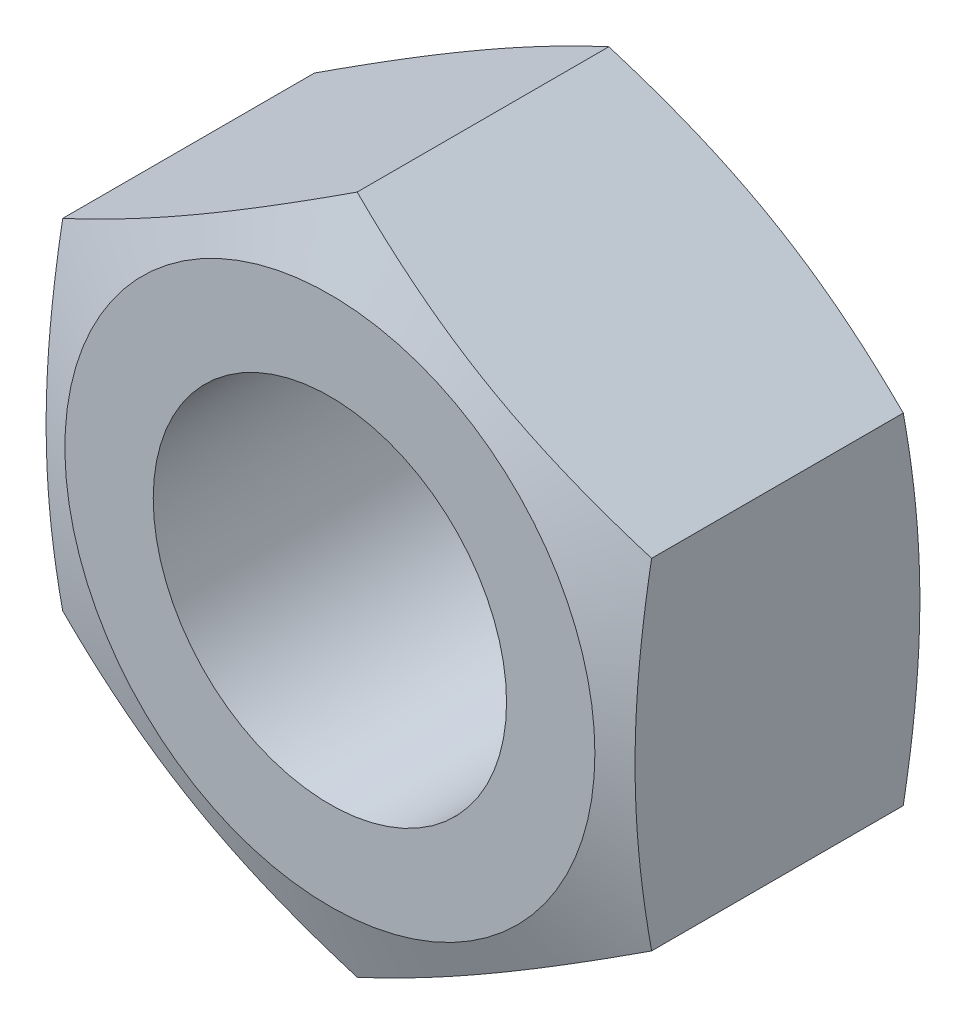
ISO-10303-21;
HEADER;
FILE_DESCRIPTION(('STEP AP214'),'2;1');
FILE_NAME('part.step','',(''),(''),'','','');
FILE_SCHEMA(('AUTOMOTIVE_DESIGN { 1 0 10303 214 1 1 1 1 }'));
ENDSEC;
DATA;
#1=APPLICATION_CONTEXT('core data for automotive mechanical design processes');
#2=APPLICATION_PROTOCOL_DEFINITION('international standard','automotive_design',2000,#1);
#3=PRODUCT_CONTEXT('',#1,'mechanical');
#4=PRODUCT('Part','Part','',(#3));
#5=PRODUCT_RELATED_PRODUCT_CATEGORY('part','',(#4));
#6=PRODUCT_DEFINITION_FORMATION('','',#4);
#7=PRODUCT_DEFINITION_CONTEXT('part definition',#1,'design');
#8=PRODUCT_DEFINITION('design','',#6,#7);
#9=PRODUCT_DEFINITION_SHAPE('','',#8);
#10=(LENGTH_UNIT() NAMED_UNIT(*) SI_UNIT(.MILLI.,.METRE.));
#11=(NAMED_UNIT(*) PLANE_ANGLE_UNIT() SI_UNIT($,.RADIAN.));
#12=(NAMED_UNIT(*) SI_UNIT($,.STERADIAN.) SOLID_ANGLE_UNIT());
#13=UNCERTAINTY_MEASURE_WITH_UNIT(LENGTH_MEASURE(1.E-05),#10,'distance_accuracy_value','');
#14=(GEOMETRIC_REPRESENTATION_CONTEXT(3) GLOBAL_UNCERTAINTY_ASSIGNED_CONTEXT((#13)) GLOBAL_UNIT_ASSIGNED_CONTEXT((#10,
#11,#12)) REPRESENTATION_CONTEXT('',''));
#15=CARTESIAN_POINT('',(0.,0.,0.));
#16=DIRECTION('',(0.,0.,1.));
#17=DIRECTION('',(1.,0.,0.));
#18=AXIS2_PLACEMENT_3D('',#15,#16,#17);
#19=CARTESIAN_POINT('',(5.,2.88675134594813,5.2));
#20=DIRECTION('',(-0.5,-0.866025403784439,0.));
#21=DIRECTION('',(0.866025403784439,-0.5,0.));
#22=AXIS2_PLACEMENT_3D('',#19,#20,#21);
#23=PLANE('',#22);
#24=DIRECTION('',(0.,0.,-1.));
#25=VECTOR('',#24,1.);
#26=CARTESIAN_POINT('',(5.,2.88675134594813,5.2));
#27=LINE('',#26,#25);
#28=CARTESIAN_POINT('',(5.,2.88675134594813,4.73648292689189));
#29=VERTEX_POINT('',#28);
#30=CARTESIAN_POINT('',(5.,2.88675134594813,0.463517073108111));
#31=VERTEX_POINT('',#30);
#32=EDGE_CURVE('E106',#29,#31,#27,.T.);
#33=ORIENTED_EDGE('',*,*,#32,.T.);
#34=CARTESIAN_POINT('',(5.0002,2.88663587589429,0.463559102031462));
#35=CARTESIAN_POINT('',(4.793122539321,3.00619210356042,0.42002728062305));
#36=CARTESIAN_POINT('',(4.58536221220616,3.12614258434709,0.380427506316752));
#37=CARTESIAN_POINT('',(4.16849063548728,3.36682350138324,0.310757770445215));
#38=CARTESIAN_POINT('',(3.95937845852842,3.48755447304127,0.280695266568772));
#39=CARTESIAN_POINT('',(3.54212392488155,3.72845649036288,0.232070006277416));
#40=CARTESIAN_POINT('',(3.33399109798324,3.84862203399982,0.213401187348765));
#41=CARTESIAN_POINT('',(2.91723870610194,4.0892341396379,0.188361048549594));
#42=CARTESIAN_POINT('',(2.70861935305097,4.20968057928005,0.181985117133098));
#43=CARTESIAN_POINT('',(2.29138064694903,4.45057345856434,0.181985117133098));
#44=CARTESIAN_POINT('',(2.08276129389806,4.57101989820648,0.188361048549594));
#45=CARTESIAN_POINT('',(1.66600890201676,4.81163200384457,0.213401187348764));
#46=CARTESIAN_POINT('',(1.45787607511845,4.93179754748151,0.232070006277416));
#47=CARTESIAN_POINT('',(1.04062154147158,5.17269956480312,0.280695266568772));
#48=CARTESIAN_POINT('',(0.831509364512723,5.29343053646114,0.310757770445214));
#49=CARTESIAN_POINT('',(0.414637787793839,5.53411145349729,0.380427506316752));
#50=CARTESIAN_POINT('',(0.206877460678999,5.65406193428397,0.420027280623049));
#51=CARTESIAN_POINT('',(-0.00019999999999951,5.77361816195009,0.463559102031462));
#52=B_SPLINE_CURVE_WITH_KNOTS('',3,(#34,#35,#36,#37,#38,#39,#40,#41,#42,#43,#44,#45,#46,#47,#48,
#49,#50,#51),.UNSPECIFIED.,.F.,.F.,(4,2,2,2,2,2,2,2,4),(0.,0.729203512834577,1.45897583043699,
2.18184682225058,2.90444658389739,3.6270463455442,4.34991733735779,5.0796896549602,
5.80889316779478),.UNSPECIFIED.);
#53=CARTESIAN_POINT('',(0.,5.77350269189626,0.463517073108112));
#54=VERTEX_POINT('',#53);
#55=EDGE_CURVE('E57',#31,#54,#52,.T.);
#56=ORIENTED_EDGE('',*,*,#55,.T.);
#57=DIRECTION('',(0.,0.,-1.));
#58=VECTOR('',#57,1.);
#59=CARTESIAN_POINT('',(0.,5.77350269189626,5.2));
#60=LINE('',#59,#58);
#61=CARTESIAN_POINT('',(0.,5.77350269189626,4.73648292689189));
#62=VERTEX_POINT('',#61);
#63=EDGE_CURVE('E11',#62,#54,#60,.T.);
#64=ORIENTED_EDGE('',*,*,#63,.F.);
#65=CARTESIAN_POINT('',(-0.000199999999999613,5.77361816195009,4.73644089796854));
#66=CARTESIAN_POINT('',(0.206877460679,5.65406193428397,4.77997271937695));
#67=CARTESIAN_POINT('',(0.414637787793839,5.53411145349729,4.81957249368325));
#68=CARTESIAN_POINT('',(0.831509364512722,5.29343053646114,4.88924222955479));
#69=CARTESIAN_POINT('',(1.04062154147158,5.17269956480312,4.91930473343123));
#70=CARTESIAN_POINT('',(1.45787607511845,4.93179754748151,4.96792999372258));
#71=CARTESIAN_POINT('',(1.66600890201676,4.81163200384457,4.98659881265124));
#72=CARTESIAN_POINT('',(2.08276129389806,4.57101989820648,5.01163895145041));
#73=CARTESIAN_POINT('',(2.29138064694903,4.45057345856434,5.0180148828669));
#74=CARTESIAN_POINT('',(2.70861935305097,4.20968057928005,5.0180148828669));
#75=CARTESIAN_POINT('',(2.91723870610194,4.0892341396379,5.01163895145041));
#76=CARTESIAN_POINT('',(3.33399109798324,3.84862203399982,4.98659881265124));
#77=CARTESIAN_POINT('',(3.54212392488155,3.72845649036288,4.96792999372258));
#78=CARTESIAN_POINT('',(3.95937845852842,3.48755447304127,4.91930473343123));
#79=CARTESIAN_POINT('',(4.16849063548728,3.36682350138324,4.88924222955478));
#80=CARTESIAN_POINT('',(4.58536221220616,3.12614258434709,4.81957249368325));
#81=CARTESIAN_POINT('',(4.793122539321,3.00619210356042,4.77997271937695));
#82=CARTESIAN_POINT('',(5.0002,2.88663587589429,4.73644089796854));
#83=B_SPLINE_CURVE_WITH_KNOTS('',3,(#65,#66,#67,#68,#69,#70,#71,#72,#73,#74,#75,#76,#77,#78,#79,
#80,#81,#82),.UNSPECIFIED.,.F.,.F.,(4,2,2,2,2,2,2,2,4),(0.,0.729203512834576,1.45897583043699,
2.18184682225058,2.90444658389739,3.6270463455442,4.34991733735779,5.0796896549602,
5.80889316779478),.UNSPECIFIED.);
#84=EDGE_CURVE('E113',#62,#29,#83,.T.);
#85=ORIENTED_EDGE('',*,*,#84,.T.);
#86=EDGE_LOOP('',(#33,#56,#64,#85));
#87=FACE_BOUND('',#86,.T.);
#88=ADVANCED_FACE('F42',(#87),#23,.F.);
#89=CARTESIAN_POINT('',(0.,5.77350269189626,5.2));
#90=DIRECTION('',(0.5,-0.866025403784439,0.));
#91=DIRECTION('',(0.866025403784439,0.5,0.));
#92=AXIS2_PLACEMENT_3D('',#89,#90,#91);
#93=PLANE('',#92);
#94=ORIENTED_EDGE('',*,*,#63,.T.);
#95=CARTESIAN_POINT('',(0.000200000000000437,5.7736181619501,0.463559102031462));
#96=CARTESIAN_POINT('',(-0.206877460678999,5.65406193428397,0.42002728062305));
#97=CARTESIAN_POINT('',(-0.414637787793838,5.53411145349729,0.380427506316752));
#98=CARTESIAN_POINT('',(-0.831509364512722,5.29343053646114,0.310757770445215));
#99=CARTESIAN_POINT('',(-1.04062154147157,5.17269956480312,0.280695266568772));
#100=CARTESIAN_POINT('',(-1.45787607511845,4.93179754748151,0.232070006277416));
#101=CARTESIAN_POINT('',(-1.66600890201676,4.81163200384457,0.213401187348764));
#102=CARTESIAN_POINT('',(-2.08276129389805,4.57101989820648,0.188361048549594));
#103=CARTESIAN_POINT('',(-2.29138064694903,4.45057345856434,0.181985117133098));
#104=CARTESIAN_POINT('',(-2.70861935305097,4.20968057928005,0.181985117133098));
#105=CARTESIAN_POINT('',(-2.91723870610194,4.08923413963791,0.188361048549594));
#106=CARTESIAN_POINT('',(-3.33399109798324,3.84862203399982,0.213401187348764));
#107=CARTESIAN_POINT('',(-3.54212392488155,3.72845649036288,0.232070006277416));
#108=CARTESIAN_POINT('',(-3.95937845852842,3.48755447304127,0.280695266568772));
#109=CARTESIAN_POINT('',(-4.16849063548728,3.36682350138325,0.310757770445214));
#110=CARTESIAN_POINT('',(-4.58536221220616,3.12614258434709,0.380427506316752));
#111=CARTESIAN_POINT('',(-4.793122539321,3.00619210356042,0.420027280623049));
#112=CARTESIAN_POINT('',(-5.0002,2.88663587589429,0.463559102031462));
#113=B_SPLINE_CURVE_WITH_KNOTS('',3,(#95,#96,#97,#98,#99,#100,#101,#102,#103,#104,#105,#106,
#107,#108,#109,#110,#111,#112),.UNSPECIFIED.,.F.,.F.,(4,2,2,2,2,2,2,2,4),(0.,0.729203512834577,
1.45897583043698,2.18184682225058,2.90444658389739,3.6270463455442,4.34991733735779,
5.0796896549602,5.80889316779478),.UNSPECIFIED.);
#114=CARTESIAN_POINT('',(-5.,2.88675134594813,0.463517073108112));
#115=VERTEX_POINT('',#114);
#116=EDGE_CURVE('E93',#54,#115,#113,.T.);
#117=ORIENTED_EDGE('',*,*,#116,.T.);
#118=DIRECTION('',(0.,0.,-1.));
#119=VECTOR('',#118,1.);
#120=CARTESIAN_POINT('',(-5.,2.88675134594813,5.2));
#121=LINE('',#120,#119);
#122=CARTESIAN_POINT('',(-5.,2.88675134594813,4.73648292689189));
#123=VERTEX_POINT('',#122);
#124=EDGE_CURVE('E50',#123,#115,#121,.T.);
#125=ORIENTED_EDGE('',*,*,#124,.F.);
#126=CARTESIAN_POINT('',(-5.0002,2.88663587589429,4.73644089796854));
#127=CARTESIAN_POINT('',(-4.793122539321,3.00619210356042,4.77997271937695));
#128=CARTESIAN_POINT('',(-4.58536221220616,3.12614258434709,4.81957249368325));
#129=CARTESIAN_POINT('',(-4.16849063548728,3.36682350138324,4.88924222955478));
#130=CARTESIAN_POINT('',(-3.95937845852842,3.48755447304127,4.91930473343123));
#131=CARTESIAN_POINT('',(-3.54212392488155,3.72845649036288,4.96792999372258));
#132=CARTESIAN_POINT('',(-3.33399109798324,3.84862203399982,4.98659881265124));
#133=CARTESIAN_POINT('',(-2.91723870610194,4.0892341396379,5.01163895145041));
#134=CARTESIAN_POINT('',(-2.70861935305097,4.20968057928005,5.0180148828669));
#135=CARTESIAN_POINT('',(-2.29138064694903,4.45057345856434,5.0180148828669));
#136=CARTESIAN_POINT('',(-2.08276129389806,4.57101989820648,5.01163895145041));
#137=CARTESIAN_POINT('',(-1.66600890201676,4.81163200384457,4.98659881265124));
#138=CARTESIAN_POINT('',(-1.45787607511845,4.93179754748151,4.96792999372258));
#139=CARTESIAN_POINT('',(-1.04062154147158,5.17269956480312,4.91930473343123));
#140=CARTESIAN_POINT('',(-0.831509364512723,5.29343053646114,4.88924222955479));
#141=CARTESIAN_POINT('',(-0.414637787793839,5.53411145349729,4.81957249368325));
#142=CARTESIAN_POINT('',(-0.206877460678999,5.65406193428397,4.77997271937695));
#143=CARTESIAN_POINT('',(0.000199999999999708,5.77361816195009,4.73644089796854));
#144=B_SPLINE_CURVE_WITH_KNOTS('',3,(#126,#127,#128,#129,#130,#131,#132,#133,#134,#135,#136,
#137,#138,#139,#140,#141,#142,#143),.UNSPECIFIED.,.F.,.F.,(4,2,2,2,2,2,2,2,4),(0.,
0.729203512834576,1.45897583043699,2.18184682225058,2.90444658389739,3.6270463455442,
4.34991733735779,5.0796896549602,5.80889316779478),.UNSPECIFIED.);
#145=EDGE_CURVE('E111',#123,#62,#144,.T.);
#146=ORIENTED_EDGE('',*,*,#145,.T.);
#147=EDGE_LOOP('',(#94,#117,#125,#146));
#148=FACE_BOUND('',#147,.T.);
#149=ADVANCED_FACE('F110',(#148),#93,.F.);
#150=CARTESIAN_POINT('',(-5.,2.88675134594813,5.2));
#151=DIRECTION('',(1.,0.,0.));
#152=DIRECTION('',(0.,1.,0.));
#153=AXIS2_PLACEMENT_3D('',#150,#151,#152);
#154=PLANE('',#153);
#155=ORIENTED_EDGE('',*,*,#124,.T.);
#156=CARTESIAN_POINT('',(-5.,-7.62577906692791,1.68110557708335));
#157=CARTESIAN_POINT('',(-5.,-7.39973732850278,1.61232290372658));
#158=CARTESIAN_POINT('',(-5.,-7.17344560747789,1.54434668666239));
#159=CARTESIAN_POINT('',(-5.,-6.72023496786584,1.4104533581759));
#160=CARTESIAN_POINT('',(-5.,-6.49331600080425,1.34453641103066));
#161=CARTESIAN_POINT('',(-5.,-6.03833144551677,1.21509710620893));
#162=CARTESIAN_POINT('',(-5.,-5.81026450257581,1.15157949318037));
#163=CARTESIAN_POINT('',(-5.,-5.35327977716749,1.027686998097));
#164=CARTESIAN_POINT('',(-5.,-5.12436201018559,0.967312059141014));
#165=CARTESIAN_POINT('',(-5.,-4.66837924069835,0.85121014946402));
#166=CARTESIAN_POINT('',(-5.,-4.44132665054132,0.795434672715088));
#167=CARTESIAN_POINT('',(-5.,-3.98610278527542,0.688661759385178));
#168=CARTESIAN_POINT('',(-5.,-3.75793155623224,0.637664127762475));
#169=CARTESIAN_POINT('',(-5.,-3.30040291605934,0.541636385908812));
#170=CARTESIAN_POINT('',(-5.,-3.07104591163479,0.496604354541588));
#171=CARTESIAN_POINT('',(-5.,-2.61100127070718,0.413885508052961));
#172=CARTESIAN_POINT('',(-5.,-2.38031367944826,0.376198444677951));
#173=CARTESIAN_POINT('',(-5.,-1.94361500804652,0.31343759806696));
#174=CARTESIAN_POINT('',(-5.,-1.7377404283577,0.287422870136569));
#175=CARTESIAN_POINT('',(-5.,-1.32512603178955,0.243443876542075));
#176=CARTESIAN_POINT('',(-5.,-1.1183862403761,0.225479375593521));
#177=CARTESIAN_POINT('',(-5.,-0.704461111310275,0.198466230617729));
#178=CARTESIAN_POINT('',(-5.,-0.497276187682008,0.189411344144595));
#179=CARTESIAN_POINT('',(-5.,-0.0827066694415578,0.180675368238058));
#180=CARTESIAN_POINT('',(-5.,0.124677923844358,0.180994216965114));
#181=CARTESIAN_POINT('',(-5.,0.540283470227912,0.191014021569927));
#182=CARTESIAN_POINT('',(-5.,0.748503241235951,0.200763207247524));
#183=CARTESIAN_POINT('',(-5.,1.16432661228743,0.229195694847162));
#184=CARTESIAN_POINT('',(-5.,1.37193019742069,0.247879211212779));
#185=CARTESIAN_POINT('',(-5.,1.78642062399795,0.293310008096314));
#186=CARTESIAN_POINT('',(-5.,1.99330669800377,0.320064190888322));
#187=CARTESIAN_POINT('',(-5.,2.40604369125849,0.380556169518772));
#188=CARTESIAN_POINT('',(-5.,2.61189460556104,0.414293998695126));
#189=CARTESIAN_POINT('',(-5.,3.03486862606037,0.48986449701936));
#190=CARTESIAN_POINT('',(-5.,3.25192603358502,0.532061691200861));
#191=CARTESIAN_POINT('',(-5.,3.68492123231093,0.621887689980025));
#192=CARTESIAN_POINT('',(-5.,3.90085893664527,0.669516909594772));
#193=CARTESIAN_POINT('',(-5.,4.33177116274142,0.76920107740676));
#194=CARTESIAN_POINT('',(-5.,4.54674538165166,0.821257326729363));
#195=CARTESIAN_POINT('',(-5.,4.97578638620893,0.928945457635204));
#196=CARTESIAN_POINT('',(-5.,5.18985319381151,0.98457725217277));
#197=CARTESIAN_POINT('',(-5.,5.61748376706862,1.09881748999222));
#198=CARTESIAN_POINT('',(-5.,5.83104652944243,1.15742967554669));
#199=CARTESIAN_POINT('',(-5.,6.2575062430239,1.27703251601743));
#200=CARTESIAN_POINT('',(-5.,6.47040318438765,1.33802320592106));
#201=CARTESIAN_POINT('',(-5.,7.10816878406084,1.52387795762354));
#202=CARTESIAN_POINT('',(-5.,7.53219060521417,1.65164600340336));
#203=CARTESIAN_POINT('',(-5.,8.37376638934151,1.91099646113511));
#204=CARTESIAN_POINT('',(-5.,8.79133900560871,2.0425188384191));
#205=CARTESIAN_POINT('',(-5.,9.62531656147031,2.30927659196911));
#206=CARTESIAN_POINT('',(-5.,10.0417214432998,2.44451214846679));
#207=CARTESIAN_POINT('',(-5.,10.8720585516144,2.7171651072236));
#208=CARTESIAN_POINT('',(-5.,11.2859941575418,2.85457224827374));
#209=CARTESIAN_POINT('',(-5.,12.1131437905115,3.13143055606296));
#210=CARTESIAN_POINT('',(-5.,12.5263578743287,3.27088155303858));
#211=CARTESIAN_POINT('',(-5.,12.9393260697749,3.41104737168424));
#212=B_SPLINE_CURVE_WITH_KNOTS('',3,(#156,#157,#158,#159,#160,#161,#162,#163,#164,#165,#166,
#167,#168,#169,#170,#171,#172,#173,#174,#175,#176,#177,#178,#179,#180,#181,#182,#183,#184,#185,
#186,#187,#188,#189,#190,#191,#192,#193,#194,#195,#196,#197,#198,#199,#200,#201,#202,#203,#204,
#205,#206,#207,#208,#209,#210,#211),.UNSPECIFIED.,.F.,.F.,(4,2,2,2,2,2,2,2,2,2,2,2,2,2,2,2,2,2,
2,2,2,2,2,2,2,2,2,4),(0.,0.70883036915644,1.41771714119476,2.12793926066641,2.83814851639712,
3.53951632412979,4.24085548806128,4.94196824383921,5.64305729849731,6.26545529357321,
6.88783509660005,7.50977852332254,8.1317178470182,8.75685488001581,9.38200691842967,
10.0076951285828,10.6333863256597,11.296663991941,11.9599923678895,12.6235163774958,
13.2870242399054,13.9513868500891,14.6157592366149,15.9442603616081,17.2576272077133,
18.5710579155931,19.879490470661,21.1878149558909),.UNSPECIFIED.);
#213=CARTESIAN_POINT('',(-5.,-2.88675134594813,0.463517073108112));
#214=VERTEX_POINT('',#213);
#215=EDGE_CURVE('E96',#115,#214,#212,.F.);
#216=ORIENTED_EDGE('',*,*,#215,.T.);
#217=DIRECTION('',(0.,0.,-1.));
#218=VECTOR('',#217,1.);
#219=CARTESIAN_POINT('',(-5.,-2.88675134594813,5.2));
#220=LINE('',#219,#218);
#221=CARTESIAN_POINT('',(-5.,-2.88675134594813,4.73648292689189));
#222=VERTEX_POINT('',#221);
#223=EDGE_CURVE('E222',#222,#214,#220,.T.);
#224=ORIENTED_EDGE('',*,*,#223,.F.);
#225=CARTESIAN_POINT('',(-5.,-7.62577906692791,3.51889442291665));
#226=CARTESIAN_POINT('',(-5.,-7.39973732850277,3.58767709627342));
#227=CARTESIAN_POINT('',(-5.,-7.17344560747789,3.65565331333761));
#228=CARTESIAN_POINT('',(-5.,-6.72023496786584,3.7895466418241));
#229=CARTESIAN_POINT('',(-5.,-6.49331600080425,3.85546358896934));
#230=CARTESIAN_POINT('',(-5.,-6.03833144551676,3.98490289379107));
#231=CARTESIAN_POINT('',(-5.,-5.81026450257581,4.04842050681964));
#232=CARTESIAN_POINT('',(-5.,-5.35327977716749,4.172313001903));
#233=CARTESIAN_POINT('',(-5.,-5.12436201018558,4.23268794085899));
#234=CARTESIAN_POINT('',(-5.,-4.66837924069834,4.34878985053598));
#235=CARTESIAN_POINT('',(-5.,-4.44132665054132,4.40456532728491));
#236=CARTESIAN_POINT('',(-5.,-3.98610278527542,4.51133824061482));
#237=CARTESIAN_POINT('',(-5.,-3.75793155623224,4.56233587223752));
#238=CARTESIAN_POINT('',(-5.,-3.30040291605934,4.65836361409119));
#239=CARTESIAN_POINT('',(-5.,-3.07104591163479,4.70339564545841));
#240=CARTESIAN_POINT('',(-5.,-2.61100127070718,4.78611449194704));
#241=CARTESIAN_POINT('',(-5.,-2.38031367944826,4.82380155532205));
#242=CARTESIAN_POINT('',(-5.,-1.94361500804652,4.88656240193304));
#243=CARTESIAN_POINT('',(-5.,-1.7377404283577,4.91257712986343));
#244=CARTESIAN_POINT('',(-5.,-1.32512603178955,4.95655612345792));
#245=CARTESIAN_POINT('',(-5.,-1.1183862403761,4.97452062440648));
#246=CARTESIAN_POINT('',(-5.,-0.704461111310274,5.00153376938227));
#247=CARTESIAN_POINT('',(-5.,-0.497276187682007,5.0105886558554));
#248=CARTESIAN_POINT('',(-5.,-0.0827066694415569,5.01932463176194));
#249=CARTESIAN_POINT('',(-5.,0.124677923844359,5.01900578303488));
#250=CARTESIAN_POINT('',(-5.,0.540283470227913,5.00898597843007));
#251=CARTESIAN_POINT('',(-5.,0.748503241235951,4.99923679275248));
#252=CARTESIAN_POINT('',(-5.,1.16432661228743,4.97080430515284));
#253=CARTESIAN_POINT('',(-5.,1.37193019742069,4.95212078878722));
#254=CARTESIAN_POINT('',(-5.,1.78642062399795,4.90668999190369));
#255=CARTESIAN_POINT('',(-5.,1.99330669800377,4.87993580911168));
#256=CARTESIAN_POINT('',(-5.,2.4060436912585,4.81944383048123));
#257=CARTESIAN_POINT('',(-5.,2.61189460556104,4.78570600130487));
#258=CARTESIAN_POINT('',(-5.,3.03486862606037,4.71013550298064));
#259=CARTESIAN_POINT('',(-5.,3.25192603358502,4.66793830879914));
#260=CARTESIAN_POINT('',(-5.,3.68492123231093,4.57811231001998));
#261=CARTESIAN_POINT('',(-5.,3.90085893664527,4.53048309040523));
#262=CARTESIAN_POINT('',(-5.,4.33177116274142,4.43079892259324));
#263=CARTESIAN_POINT('',(-5.,4.54674538165166,4.37874267327064));
#264=CARTESIAN_POINT('',(-5.,4.97578638620893,4.2710545423648));
#265=CARTESIAN_POINT('',(-5.,5.18985319381151,4.21542274782723));
#266=CARTESIAN_POINT('',(-5.,5.61748376706862,4.10118251000778));
#267=CARTESIAN_POINT('',(-5.,5.83104652944243,4.04257032445331));
#268=CARTESIAN_POINT('',(-5.,6.2575062430239,3.92296748398257));
#269=CARTESIAN_POINT('',(-5.,6.47040318438765,3.86197679407894));
#270=CARTESIAN_POINT('',(-5.,7.10816878406084,3.67612204237646));
#271=CARTESIAN_POINT('',(-5.,7.53219060521417,3.54835399659664));
#272=CARTESIAN_POINT('',(-5.,8.37376638934151,3.28900353886489));
#273=CARTESIAN_POINT('',(-5.,8.79133900560871,3.1574811615809));
#274=CARTESIAN_POINT('',(-5.,9.62531656147031,2.89072340803089));
#275=CARTESIAN_POINT('',(-5.,10.0417214432998,2.75548785153321));
#276=CARTESIAN_POINT('',(-5.,10.8720585516144,2.48283489277639));
#277=CARTESIAN_POINT('',(-5.,11.2859941575418,2.34542775172625));
#278=CARTESIAN_POINT('',(-5.,12.1131437905115,2.06856944393704));
#279=CARTESIAN_POINT('',(-5.,12.5263578743287,1.92911844696142));
#280=CARTESIAN_POINT('',(-5.,12.9393260697749,1.78895262831576));
#281=B_SPLINE_CURVE_WITH_KNOTS('',3,(#225,#226,#227,#228,#229,#230,#231,#232,#233,#234,#235,
#236,#237,#238,#239,#240,#241,#242,#243,#244,#245,#246,#247,#248,#249,#250,#251,#252,#253,#254,
#255,#256,#257,#258,#259,#260,#261,#262,#263,#264,#265,#266,#267,#268,#269,#270,#271,#272,#273,
#274,#275,#276,#277,#278,#279,#280),.UNSPECIFIED.,.F.,.F.,(4,2,2,2,2,2,2,2,2,2,2,2,2,2,2,2,2,2,
2,2,2,2,2,2,2,2,2,4),(0.,0.708830369156441,1.41771714119476,2.12793926066641,2.83814851639712,
3.5395163241298,4.24085548806128,4.94196824383921,5.64305729849731,6.26545529357321,
6.88783509660005,7.50977852332254,8.1317178470182,8.7568548800158,9.38200691842967,
10.0076951285828,10.6333863256597,11.296663991941,11.9599923678895,12.6235163774958,
13.2870242399054,13.9513868500891,14.6157592366149,15.9442603616081,17.2576272077133,
18.5710579155931,19.879490470661,21.1878149558909),.UNSPECIFIED.);
#282=EDGE_CURVE('E114',#222,#123,#281,.T.);
#283=ORIENTED_EDGE('',*,*,#282,.T.);
#284=EDGE_LOOP('',(#155,#216,#224,#283));
#285=FACE_BOUND('',#284,.T.);
#286=ADVANCED_FACE('F176',(#285),#154,.F.);
#287=CARTESIAN_POINT('',(-5.,-2.88675134594813,5.2));
#288=DIRECTION('',(0.5,0.866025403784439,0.));
#289=DIRECTION('',(-0.866025403784439,0.5,0.));
#290=AXIS2_PLACEMENT_3D('',#287,#288,#289);
#291=PLANE('',#290);
#292=ORIENTED_EDGE('',*,*,#223,.T.);
#293=CARTESIAN_POINT('',(-5.0002,-2.88663587589429,0.463559102031462));
#294=CARTESIAN_POINT('',(-4.793122539321,-3.00619210356042,0.42002728062305));
#295=CARTESIAN_POINT('',(-4.58536221220616,-3.12614258434709,0.380427506316753));
#296=CARTESIAN_POINT('',(-4.16849063548728,-3.36682350138324,0.310757770445215));
#297=CARTESIAN_POINT('',(-3.95937845852842,-3.48755447304127,0.280695266568772));
#298=CARTESIAN_POINT('',(-3.54212392488155,-3.72845649036288,0.232070006277416));
#299=CARTESIAN_POINT('',(-3.33399109798324,-3.84862203399982,0.213401187348765));
#300=CARTESIAN_POINT('',(-2.91723870610195,-4.0892341396379,0.188361048549594));
#301=CARTESIAN_POINT('',(-2.70861935305097,-4.20968057928005,0.181985117133098));
#302=CARTESIAN_POINT('',(-2.29138064694903,-4.45057345856434,0.181985117133098));
#303=CARTESIAN_POINT('',(-2.08276129389806,-4.57101989820648,0.188361048549595));
#304=CARTESIAN_POINT('',(-1.66600890201676,-4.81163200384457,0.213401187348765));
#305=CARTESIAN_POINT('',(-1.45787607511845,-4.93179754748151,0.232070006277416));
#306=CARTESIAN_POINT('',(-1.04062154147158,-5.17269956480312,0.280695266568772));
#307=CARTESIAN_POINT('',(-0.831509364512724,-5.29343053646114,0.310757770445215));
#308=CARTESIAN_POINT('',(-0.41463778779384,-5.53411145349729,0.380427506316752));
#309=CARTESIAN_POINT('',(-0.206877460679,-5.65406193428397,0.42002728062305));
#310=CARTESIAN_POINT('',(0.000199999999998887,-5.7736181619501,0.463559102031462));
#311=B_SPLINE_CURVE_WITH_KNOTS('',3,(#293,#294,#295,#296,#297,#298,#299,#300,#301,#302,#303,
#304,#305,#306,#307,#308,#309,#310),.UNSPECIFIED.,.F.,.F.,(4,2,2,2,2,2,2,2,4),(0.,
0.729203512834578,1.45897583043699,2.18184682225058,2.90444658389739,3.6270463455442,
4.3499173373578,5.07968965496021,5.80889316779478),.UNSPECIFIED.);
#312=CARTESIAN_POINT('',(0.,-5.77350269189626,0.463517073108112));
#313=VERTEX_POINT('',#312);
#314=EDGE_CURVE('E182',#214,#313,#311,.T.);
#315=ORIENTED_EDGE('',*,*,#314,.T.);
#316=DIRECTION('',(0.,0.,-1.));
#317=VECTOR('',#316,1.);
#318=CARTESIAN_POINT('',(0.,-5.77350269189626,5.2));
#319=LINE('',#318,#317);
#320=CARTESIAN_POINT('',(0.,-5.77350269189626,4.73648292689189));
#321=VERTEX_POINT('',#320);
#322=EDGE_CURVE('E218',#321,#313,#319,.T.);
#323=ORIENTED_EDGE('',*,*,#322,.F.);
#324=CARTESIAN_POINT('',(0.000199999999999722,-5.7736181619501,4.73644089796854));
#325=CARTESIAN_POINT('',(-0.206877460679,-5.65406193428397,4.77997271937695));
#326=CARTESIAN_POINT('',(-0.414637787793839,-5.53411145349729,4.81957249368325));
#327=CARTESIAN_POINT('',(-0.831509364512723,-5.29343053646114,4.88924222955478));
#328=CARTESIAN_POINT('',(-1.04062154147158,-5.17269956480312,4.91930473343123));
#329=CARTESIAN_POINT('',(-1.45787607511845,-4.93179754748151,4.96792999372258));
#330=CARTESIAN_POINT('',(-1.66600890201676,-4.81163200384457,4.98659881265124));
#331=CARTESIAN_POINT('',(-2.08276129389806,-4.57101989820648,5.01163895145041));
#332=CARTESIAN_POINT('',(-2.29138064694903,-4.45057345856434,5.0180148828669));
#333=CARTESIAN_POINT('',(-2.70861935305097,-4.20968057928005,5.0180148828669));
#334=CARTESIAN_POINT('',(-2.91723870610194,-4.0892341396379,5.01163895145041));
#335=CARTESIAN_POINT('',(-3.33399109798324,-3.84862203399982,4.98659881265124));
#336=CARTESIAN_POINT('',(-3.54212392488155,-3.72845649036288,4.96792999372258));
#337=CARTESIAN_POINT('',(-3.95937845852843,-3.48755447304127,4.91930473343123));
#338=CARTESIAN_POINT('',(-4.16849063548728,-3.36682350138324,4.88924222955479));
#339=CARTESIAN_POINT('',(-4.58536221220616,-3.12614258434709,4.81957249368325));
#340=CARTESIAN_POINT('',(-4.793122539321,-3.00619210356041,4.77997271937695));
#341=CARTESIAN_POINT('',(-5.0002,-2.88663587589429,4.73644089796854));
#342=B_SPLINE_CURVE_WITH_KNOTS('',3,(#324,#325,#326,#327,#328,#329,#330,#331,#332,#333,#334,
#335,#336,#337,#338,#339,#340,#341),.UNSPECIFIED.,.F.,.F.,(4,2,2,2,2,2,2,2,4),(0.,
0.729203512834577,1.45897583043699,2.18184682225058,2.90444658389739,3.6270463455442,
4.3499173373578,5.07968965496021,5.80889316779478),.UNSPECIFIED.);
#343=EDGE_CURVE('E117',#321,#222,#342,.T.);
#344=ORIENTED_EDGE('',*,*,#343,.T.);
#345=EDGE_LOOP('',(#292,#315,#323,#344));
#346=FACE_BOUND('',#345,.T.);
#347=ADVANCED_FACE('F172',(#346),#291,.F.);
#348=CARTESIAN_POINT('',(0.,-5.77350269189626,5.2));
#349=DIRECTION('',(-0.5,0.866025403784439,0.));
#350=DIRECTION('',(-0.866025403784439,-0.5,0.));
#351=AXIS2_PLACEMENT_3D('',#348,#349,#350);
#352=PLANE('',#351);
#353=ORIENTED_EDGE('',*,*,#322,.T.);
#354=CARTESIAN_POINT('',(-0.000200000000000329,-5.7736181619501,0.463559102031462));
#355=CARTESIAN_POINT('',(0.206877460678999,-5.65406193428397,0.42002728062305));
#356=CARTESIAN_POINT('',(0.414637787793839,-5.5341114534973,0.380427506316753));
#357=CARTESIAN_POINT('',(0.831509364512722,-5.29343053646114,0.310757770445215));
#358=CARTESIAN_POINT('',(1.04062154147158,-5.17269956480312,0.280695266568772));
#359=CARTESIAN_POINT('',(1.45787607511845,-4.93179754748151,0.232070006277417));
#360=CARTESIAN_POINT('',(1.66600890201676,-4.81163200384457,0.213401187348765));
#361=CARTESIAN_POINT('',(2.08276129389806,-4.57101989820648,0.188361048549595));
#362=CARTESIAN_POINT('',(2.29138064694903,-4.45057345856434,0.181985117133098));
#363=CARTESIAN_POINT('',(2.70861935305097,-4.20968057928005,0.181985117133098));
#364=CARTESIAN_POINT('',(2.91723870610194,-4.08923413963791,0.188361048549595));
#365=CARTESIAN_POINT('',(3.33399109798324,-3.84862203399982,0.213401187348765));
#366=CARTESIAN_POINT('',(3.54212392488155,-3.72845649036288,0.232070006277417));
#367=CARTESIAN_POINT('',(3.95937845852842,-3.48755447304127,0.280695266568772));
#368=CARTESIAN_POINT('',(4.16849063548728,-3.36682350138325,0.310757770445215));
#369=CARTESIAN_POINT('',(4.58536221220616,-3.1261425843471,0.380427506316753));
#370=CARTESIAN_POINT('',(4.793122539321,-3.00619210356042,0.42002728062305));
#371=CARTESIAN_POINT('',(5.0002,-2.88663587589429,0.463559102031463));
#372=B_SPLINE_CURVE_WITH_KNOTS('',3,(#354,#355,#356,#357,#358,#359,#360,#361,#362,#363,#364,
#365,#366,#367,#368,#369,#370,#371),.UNSPECIFIED.,.F.,.F.,(4,2,2,2,2,2,2,2,4),(0.,
0.729203512834577,1.45897583043699,2.18184682225058,2.90444658389739,3.6270463455442,
4.34991733735779,5.0796896549602,5.80889316779478),.UNSPECIFIED.);
#373=CARTESIAN_POINT('',(5.,-2.88675134594813,0.463517073108112));
#374=VERTEX_POINT('',#373);
#375=EDGE_CURVE('E190',#313,#374,#372,.T.);
#376=ORIENTED_EDGE('',*,*,#375,.T.);
#377=DIRECTION('',(0.,0.,-1.));
#378=VECTOR('',#377,1.);
#379=CARTESIAN_POINT('',(5.,-2.88675134594813,5.2));
#380=LINE('',#379,#378);
#381=CARTESIAN_POINT('',(5.,-2.88675134594813,4.73648292689189));
#382=VERTEX_POINT('',#381);
#383=EDGE_CURVE('E219',#382,#374,#380,.T.);
#384=ORIENTED_EDGE('',*,*,#383,.F.);
#385=CARTESIAN_POINT('',(5.0002,-2.88663587589429,4.73644089796854));
#386=CARTESIAN_POINT('',(4.793122539321,-3.00619210356042,4.77997271937695));
#387=CARTESIAN_POINT('',(4.58536221220616,-3.1261425843471,4.81957249368325));
#388=CARTESIAN_POINT('',(4.16849063548728,-3.36682350138325,4.88924222955479));
#389=CARTESIAN_POINT('',(3.95937845852842,-3.48755447304127,4.91930473343123));
#390=CARTESIAN_POINT('',(3.54212392488155,-3.72845649036288,4.96792999372258));
#391=CARTESIAN_POINT('',(3.33399109798324,-3.84862203399982,4.98659881265123));
#392=CARTESIAN_POINT('',(2.91723870610194,-4.08923413963791,5.01163895145041));
#393=CARTESIAN_POINT('',(2.70861935305097,-4.20968057928005,5.0180148828669));
#394=CARTESIAN_POINT('',(2.29138064694903,-4.45057345856434,5.0180148828669));
#395=CARTESIAN_POINT('',(2.08276129389806,-4.57101989820648,5.01163895145041));
#396=CARTESIAN_POINT('',(1.66600890201676,-4.81163200384457,4.98659881265123));
#397=CARTESIAN_POINT('',(1.45787607511845,-4.93179754748151,4.96792999372258));
#398=CARTESIAN_POINT('',(1.04062154147158,-5.17269956480312,4.91930473343123));
#399=CARTESIAN_POINT('',(0.831509364512722,-5.29343053646114,4.88924222955479));
#400=CARTESIAN_POINT('',(0.414637787793837,-5.5341114534973,4.81957249368325));
#401=CARTESIAN_POINT('',(0.206877460678998,-5.65406193428397,4.77997271937695));
#402=CARTESIAN_POINT('',(-0.000200000000000956,-5.7736181619501,4.73644089796854));
#403=B_SPLINE_CURVE_WITH_KNOTS('',3,(#385,#386,#387,#388,#389,#390,#391,#392,#393,#394,#395,
#396,#397,#398,#399,#400,#401,#402),.UNSPECIFIED.,.F.,.F.,(4,2,2,2,2,2,2,2,4),(0.,
0.729203512834577,1.45897583043699,2.18184682225058,2.90444658389739,3.6270463455442,
4.34991733735779,5.0796896549602,5.80889316779478),.UNSPECIFIED.);
#404=EDGE_CURVE('E65',#382,#321,#403,.T.);
#405=ORIENTED_EDGE('',*,*,#404,.T.);
#406=EDGE_LOOP('',(#353,#376,#384,#405));
#407=FACE_BOUND('',#406,.T.);
#408=ADVANCED_FACE('F175',(#407),#352,.F.);
#409=CARTESIAN_POINT('',(5.,-2.88675134594813,5.2));
#410=DIRECTION('',(-1.,0.,0.));
#411=DIRECTION('',(0.,-1.,0.));
#412=AXIS2_PLACEMENT_3D('',#409,#410,#411);
#413=PLANE('',#412);
#414=ORIENTED_EDGE('',*,*,#383,.T.);
#415=CARTESIAN_POINT('',(5.,-7.62577906692791,1.68110557708335));
#416=CARTESIAN_POINT('',(5.,-7.39973732850278,1.61232290372658));
#417=CARTESIAN_POINT('',(5.,-7.1734456074779,1.54434668666239));
#418=CARTESIAN_POINT('',(5.,-6.72023496786584,1.4104533581759));
#419=CARTESIAN_POINT('',(5.,-6.49331600080426,1.34453641103067));
#420=CARTESIAN_POINT('',(5.,-6.03833144551677,1.21509710620893));
#421=CARTESIAN_POINT('',(5.,-5.81026450257581,1.15157949318037));
#422=CARTESIAN_POINT('',(5.,-5.35327977716749,1.027686998097));
#423=CARTESIAN_POINT('',(5.,-5.12436201018559,0.967312059141014));
#424=CARTESIAN_POINT('',(5.,-4.66837924069835,0.85121014946402));
#425=CARTESIAN_POINT('',(5.,-4.44132665054132,0.795434672715088));
#426=CARTESIAN_POINT('',(5.,-3.98610278527542,0.688661759385178));
#427=CARTESIAN_POINT('',(5.,-3.75793155623224,0.637664127762476));
#428=CARTESIAN_POINT('',(5.,-3.30040291605935,0.541636385908812));
#429=CARTESIAN_POINT('',(5.,-3.07104591163479,0.496604354541588));
#430=CARTESIAN_POINT('',(5.,-2.61100127070718,0.413885508052962));
#431=CARTESIAN_POINT('',(5.,-2.38031367944826,0.376198444677952));
#432=CARTESIAN_POINT('',(5.,-1.94361500804652,0.313437598066961));
#433=CARTESIAN_POINT('',(5.,-1.7377404283577,0.287422870136569));
#434=CARTESIAN_POINT('',(5.,-1.32512603178955,0.243443876542075));
#435=CARTESIAN_POINT('',(5.,-1.11838624037611,0.22547937559352));
#436=CARTESIAN_POINT('',(5.,-0.704461111310278,0.198466230617729));
#437=CARTESIAN_POINT('',(5.,-0.497276187682011,0.189411344144595));
#438=CARTESIAN_POINT('',(5.,-0.0827066694415609,0.180675368238058));
#439=CARTESIAN_POINT('',(5.,0.124677923844355,0.180994216965114));
#440=CARTESIAN_POINT('',(5.,0.540283470227908,0.191014021569927));
#441=CARTESIAN_POINT('',(5.,0.748503241235946,0.200763207247524));
#442=CARTESIAN_POINT('',(5.,1.16432661228742,0.229195694847162));
#443=CARTESIAN_POINT('',(5.,1.37193019742069,0.247879211212779));
#444=CARTESIAN_POINT('',(5.,1.78642062399795,0.293310008096314));
#445=CARTESIAN_POINT('',(5.,1.99330669800377,0.320064190888321));
#446=CARTESIAN_POINT('',(5.,2.40604369125849,0.380556169518771));
#447=CARTESIAN_POINT('',(5.,2.61189460556103,0.414293998695125));
#448=CARTESIAN_POINT('',(5.,3.03486862606036,0.48986449701936));
#449=CARTESIAN_POINT('',(5.,3.25192603358502,0.53206169120086));
#450=CARTESIAN_POINT('',(5.,3.68492123231093,0.621887689980024));
#451=CARTESIAN_POINT('',(5.,3.90085893664527,0.66951690959477));
#452=CARTESIAN_POINT('',(5.,4.33177116274142,0.769201077406759));
#453=CARTESIAN_POINT('',(5.,4.54674538165165,0.821257326729362));
#454=CARTESIAN_POINT('',(5.,4.97578638620893,0.928945457635203));
#455=CARTESIAN_POINT('',(5.,5.18985319381151,0.98457725217277));
#456=CARTESIAN_POINT('',(5.,5.61748376706861,1.09881748999222));
#457=CARTESIAN_POINT('',(5.,5.83104652944243,1.15742967554669));
#458=CARTESIAN_POINT('',(5.,6.25750624302389,1.27703251601742));
#459=CARTESIAN_POINT('',(5.,6.47040318438765,1.33802320592106));
#460=CARTESIAN_POINT('',(5.,7.10816878406084,1.52387795762354));
#461=CARTESIAN_POINT('',(5.,7.53219060521417,1.65164600340336));
#462=CARTESIAN_POINT('',(5.,8.37376638934151,1.91099646113511));
#463=CARTESIAN_POINT('',(5.,8.79133900560871,2.0425188384191));
#464=CARTESIAN_POINT('',(5.,9.62531656147031,2.30927659196911));
#465=CARTESIAN_POINT('',(5.,10.0417214432998,2.44451214846679));
#466=CARTESIAN_POINT('',(5.,10.8720585516144,2.7171651072236));
#467=CARTESIAN_POINT('',(5.,11.2859941575418,2.85457224827375));
#468=CARTESIAN_POINT('',(5.,12.1131437905115,3.13143055606296));
#469=CARTESIAN_POINT('',(5.,12.5263578743287,3.27088155303858));
#470=CARTESIAN_POINT('',(5.,12.9393260697749,3.41104737168424));
#471=B_SPLINE_CURVE_WITH_KNOTS('',3,(#415,#416,#417,#418,#419,#420,#421,#422,#423,#424,#425,
#426,#427,#428,#429,#430,#431,#432,#433,#434,#435,#436,#437,#438,#439,#440,#441,#442,#443,#444,
#445,#446,#447,#448,#449,#450,#451,#452,#453,#454,#455,#456,#457,#458,#459,#460,#461,#462,#463,
#464,#465,#466,#467,#468,#469,#470),.UNSPECIFIED.,.F.,.F.,(4,2,2,2,2,2,2,2,2,2,2,2,2,2,2,2,2,2,
2,2,2,2,2,2,2,2,2,4),(0.,0.708830369156439,1.41771714119476,2.12793926066641,2.83814851639712,
3.5395163241298,4.24085548806128,4.94196824383921,5.64305729849731,6.26545529357321,
6.88783509660005,7.50977852332254,8.1317178470182,8.7568548800158,9.38200691842967,
10.0076951285828,10.6333863256597,11.296663991941,11.9599923678895,12.6235163774958,
13.2870242399054,13.9513868500891,14.6157592366149,15.9442603616081,17.2576272077133,
18.5710579155931,19.879490470661,21.1878149558909),.UNSPECIFIED.);
#472=EDGE_CURVE('E321',#374,#31,#471,.T.);
#473=ORIENTED_EDGE('',*,*,#472,.T.);
#474=ORIENTED_EDGE('',*,*,#32,.F.);
#475=CARTESIAN_POINT('',(5.,-7.62577906692791,3.51889442291665));
#476=CARTESIAN_POINT('',(5.,-7.39973732850278,3.58767709627342));
#477=CARTESIAN_POINT('',(5.,-7.17344560747789,3.65565331333761));
#478=CARTESIAN_POINT('',(5.,-6.72023496786584,3.7895466418241));
#479=CARTESIAN_POINT('',(5.,-6.49331600080425,3.85546358896933));
#480=CARTESIAN_POINT('',(5.,-6.03833144551677,3.98490289379106));
#481=CARTESIAN_POINT('',(5.,-5.81026450257581,4.04842050681963));
#482=CARTESIAN_POINT('',(5.,-5.35327977716749,4.172313001903));
#483=CARTESIAN_POINT('',(5.,-5.12436201018559,4.23268794085898));
#484=CARTESIAN_POINT('',(5.,-4.66837924069835,4.34878985053598));
#485=CARTESIAN_POINT('',(5.,-4.44132665054132,4.40456532728491));
#486=CARTESIAN_POINT('',(5.,-3.98610278527542,4.51133824061482));
#487=CARTESIAN_POINT('',(5.,-3.75793155623224,4.56233587223752));
#488=CARTESIAN_POINT('',(5.,-3.30040291605935,4.65836361409119));
#489=CARTESIAN_POINT('',(5.,-3.07104591163479,4.70339564545841));
#490=CARTESIAN_POINT('',(5.,-2.61100127070719,4.78611449194704));
#491=CARTESIAN_POINT('',(5.,-2.38031367944826,4.82380155532205));
#492=CARTESIAN_POINT('',(5.,-1.94361500804652,4.88656240193304));
#493=CARTESIAN_POINT('',(5.,-1.7377404283577,4.91257712986343));
#494=CARTESIAN_POINT('',(5.,-1.32512603178955,4.95655612345793));
#495=CARTESIAN_POINT('',(5.,-1.1183862403761,4.97452062440648));
#496=CARTESIAN_POINT('',(5.,-0.704461111310277,5.00153376938227));
#497=CARTESIAN_POINT('',(5.,-0.49727618768201,5.0105886558554));
#498=CARTESIAN_POINT('',(5.,-0.0827066694415595,5.01932463176194));
#499=CARTESIAN_POINT('',(5.,0.124677923844357,5.01900578303488));
#500=CARTESIAN_POINT('',(5.,0.54028347022791,5.00898597843007));
#501=CARTESIAN_POINT('',(5.,0.748503241235948,4.99923679275248));
#502=CARTESIAN_POINT('',(5.,1.16432661228742,4.97080430515284));
#503=CARTESIAN_POINT('',(5.,1.37193019742069,4.95212078878722));
#504=CARTESIAN_POINT('',(5.,1.78642062399795,4.90668999190369));
#505=CARTESIAN_POINT('',(5.,1.99330669800377,4.87993580911168));
#506=CARTESIAN_POINT('',(5.,2.40604369125849,4.81944383048123));
#507=CARTESIAN_POINT('',(5.,2.61189460556103,4.78570600130487));
#508=CARTESIAN_POINT('',(5.,3.03486862606036,4.71013550298064));
#509=CARTESIAN_POINT('',(5.,3.25192603358502,4.66793830879914));
#510=CARTESIAN_POINT('',(5.,3.68492123231093,4.57811231001998));
#511=CARTESIAN_POINT('',(5.,3.90085893664527,4.53048309040523));
#512=CARTESIAN_POINT('',(5.,4.33177116274142,4.43079892259324));
#513=CARTESIAN_POINT('',(5.,4.54674538165166,4.37874267327064));
#514=CARTESIAN_POINT('',(5.,4.97578638620893,4.2710545423648));
#515=CARTESIAN_POINT('',(5.,5.18985319381151,4.21542274782723));
#516=CARTESIAN_POINT('',(5.,5.61748376706862,4.10118251000778));
#517=CARTESIAN_POINT('',(5.,5.83104652944243,4.04257032445331));
#518=CARTESIAN_POINT('',(5.,6.2575062430239,3.92296748398257));
#519=CARTESIAN_POINT('',(5.,6.47040318438765,3.86197679407894));
#520=CARTESIAN_POINT('',(5.,7.10816878406084,3.67612204237646));
#521=CARTESIAN_POINT('',(5.,7.53219060521417,3.54835399659664));
#522=CARTESIAN_POINT('',(5.,8.37376638934151,3.28900353886489));
#523=CARTESIAN_POINT('',(5.,8.79133900560871,3.1574811615809));
#524=CARTESIAN_POINT('',(5.,9.62531656147031,2.89072340803089));
#525=CARTESIAN_POINT('',(5.,10.0417214432998,2.75548785153321));
#526=CARTESIAN_POINT('',(5.,10.8720585516144,2.48283489277639));
#527=CARTESIAN_POINT('',(5.,11.2859941575418,2.34542775172625));
#528=CARTESIAN_POINT('',(5.,12.1131437905115,2.06856944393704));
#529=CARTESIAN_POINT('',(5.,12.5263578743287,1.92911844696142));
#530=CARTESIAN_POINT('',(5.,12.9393260697749,1.78895262831576));
#531=B_SPLINE_CURVE_WITH_KNOTS('',3,(#475,#476,#477,#478,#479,#480,#481,#482,#483,#484,#485,
#486,#487,#488,#489,#490,#491,#492,#493,#494,#495,#496,#497,#498,#499,#500,#501,#502,#503,#504,
#505,#506,#507,#508,#509,#510,#511,#512,#513,#514,#515,#516,#517,#518,#519,#520,#521,#522,#523,
#524,#525,#526,#527,#528,#529,#530),.UNSPECIFIED.,.F.,.F.,(4,2,2,2,2,2,2,2,2,2,2,2,2,2,2,2,2,2,
2,2,2,2,2,2,2,2,2,4),(0.,0.708830369156441,1.41771714119476,2.12793926066641,2.83814851639712,
3.53951632412979,4.24085548806128,4.94196824383921,5.64305729849731,6.26545529357321,
6.88783509660005,7.50977852332254,8.1317178470182,8.7568548800158,9.38200691842967,
10.0076951285828,10.6333863256597,11.296663991941,11.9599923678895,12.6235163774958,
13.2870242399054,13.9513868500891,14.6157592366149,15.9442603616081,17.2576272077133,
18.5710579155931,19.879490470661,21.1878149558909),.UNSPECIFIED.);
#532=EDGE_CURVE('E150',#29,#382,#531,.F.);
#533=ORIENTED_EDGE('',*,*,#532,.T.);
#534=EDGE_LOOP('',(#414,#473,#474,#533));
#535=FACE_BOUND('',#534,.T.);
#536=ADVANCED_FACE('F142',(#535),#413,.F.);
#537=CARTESIAN_POINT('',(0.,0.,4.73648292689189));
#538=DIRECTION('',(0.,0.,-1.));
#539=DIRECTION('',(-1.,0.,0.));
#540=AXIS2_PLACEMENT_3D('',#537,#538,#539);
#541=CONICAL_SURFACE('',#540,5.77350269189626,1.22173047639604);
#542=CARTESIAN_POINT('',(0.,0.,5.2));
#543=DIRECTION('',(0.,0.,1.));
#544=DIRECTION('',(1.,0.,0.));
#545=AXIS2_PLACEMENT_3D('',#542,#543,#544);
#546=CIRCLE('',#545,4.5);
#547=CARTESIAN_POINT('',(4.5,0.,5.2));
#548=VERTEX_POINT('',#547);
#549=EDGE_CURVE('E107',#548,#548,#546,.T.);
#550=ORIENTED_EDGE('',*,*,#549,.F.);
#551=EDGE_LOOP('',(#550));
#552=FACE_BOUND('',#551,.T.);
#553=ORIENTED_EDGE('',*,*,#145,.F.);
#554=ORIENTED_EDGE('',*,*,#282,.F.);
#555=ORIENTED_EDGE('',*,*,#343,.F.);
#556=ORIENTED_EDGE('',*,*,#404,.F.);
#557=ORIENTED_EDGE('',*,*,#532,.F.);
#558=ORIENTED_EDGE('',*,*,#84,.F.);
#559=EDGE_LOOP('',(#553,#554,#555,#556,#557,#558));
#560=FACE_BOUND('',#559,.T.);
#561=ADVANCED_FACE('F136',(#552,#560),#541,.T.);
#562=CARTESIAN_POINT('',(0.,0.,5.2));
#563=DIRECTION('',(0.,0.,1.));
#564=DIRECTION('',(1.,0.,0.));
#565=AXIS2_PLACEMENT_3D('',#562,#563,#564);
#566=PLANE('',#565);
#567=CARTESIAN_POINT('',(0.,0.,5.2));
#568=DIRECTION('',(0.,0.,1.));
#569=DIRECTION('',(1.,0.,0.));
#570=AXIS2_PLACEMENT_3D('',#567,#568,#569);
#571=CIRCLE('',#570,3.);
#572=CARTESIAN_POINT('',(3.,0.,5.2));
#573=VERTEX_POINT('',#572);
#574=EDGE_CURVE('E315',#573,#573,#571,.T.);
#575=ORIENTED_EDGE('',*,*,#574,.F.);
#576=EDGE_LOOP('',(#575));
#577=FACE_BOUND('',#576,.T.);
#578=ORIENTED_EDGE('',*,*,#549,.T.);
#579=EDGE_LOOP('',(#578));
#580=FACE_BOUND('',#579,.T.);
#581=ADVANCED_FACE('F141',(#577,#580),#566,.T.);
#582=CARTESIAN_POINT('',(0.,0.,0.463517073108112));
#583=DIRECTION('',(0.,0.,1.));
#584=DIRECTION('',(-1.,0.,0.));
#585=AXIS2_PLACEMENT_3D('',#582,#583,#584);
#586=CONICAL_SURFACE('',#585,5.77350269189626,1.22173047639604);
#587=CARTESIAN_POINT('',(0.,0.,0.));
#588=DIRECTION('',(0.,0.,1.));
#589=DIRECTION('',(1.,0.,0.));
#590=AXIS2_PLACEMENT_3D('',#587,#588,#589);
#591=CIRCLE('',#590,4.5);
#592=CARTESIAN_POINT('',(4.5,0.,0.));
#593=VERTEX_POINT('',#592);
#594=EDGE_CURVE('E317',#593,#593,#591,.T.);
#595=ORIENTED_EDGE('',*,*,#594,.T.);
#596=EDGE_LOOP('',(#595));
#597=FACE_BOUND('',#596,.T.);
#598=ORIENTED_EDGE('',*,*,#472,.F.);
#599=ORIENTED_EDGE('',*,*,#375,.F.);
#600=ORIENTED_EDGE('',*,*,#314,.F.);
#601=ORIENTED_EDGE('',*,*,#215,.F.);
#602=ORIENTED_EDGE('',*,*,#116,.F.);
#603=ORIENTED_EDGE('',*,*,#55,.F.);
#604=EDGE_LOOP('',(#598,#599,#600,#601,#602,#603));
#605=FACE_BOUND('',#604,.T.);
#606=ADVANCED_FACE('F94',(#597,#605),#586,.T.);
#607=CARTESIAN_POINT('',(0.,0.,0.));
#608=DIRECTION('',(0.,0.,1.));
#609=DIRECTION('',(1.,0.,0.));
#610=AXIS2_PLACEMENT_3D('',#607,#608,#609);
#611=PLANE('',#610);
#612=CARTESIAN_POINT('',(0.,0.,0.));
#613=DIRECTION('',(0.,0.,1.));
#614=DIRECTION('',(1.,0.,0.));
#615=AXIS2_PLACEMENT_3D('',#612,#613,#614);
#616=CIRCLE('',#615,3.);
#617=CARTESIAN_POINT('',(3.,0.,0.));
#618=VERTEX_POINT('',#617);
#619=EDGE_CURVE('E312',#618,#618,#616,.T.);
#620=ORIENTED_EDGE('',*,*,#619,.T.);
#621=EDGE_LOOP('',(#620));
#622=FACE_BOUND('',#621,.T.);
#623=ORIENTED_EDGE('',*,*,#594,.F.);
#624=EDGE_LOOP('',(#623));
#625=FACE_BOUND('',#624,.T.);
#626=ADVANCED_FACE('F281',(#622,#625),#611,.F.);
#627=CARTESIAN_POINT('',(0.,0.,0.));
#628=DIRECTION('',(0.,0.,1.));
#629=DIRECTION('',(1.,0.,0.));
#630=AXIS2_PLACEMENT_3D('',#627,#628,#629);
#631=CYLINDRICAL_SURFACE('',#630,3.);
#632=ORIENTED_EDGE('',*,*,#619,.F.);
#633=EDGE_LOOP('',(#632));
#634=FACE_BOUND('',#633,.T.);
#635=ORIENTED_EDGE('',*,*,#574,.T.);
#636=EDGE_LOOP('',(#635));
#637=FACE_BOUND('',#636,.T.);
#638=ADVANCED_FACE('F284',(#634,#637),#631,.F.);
#639=CLOSED_SHELL('',(#88,#149,#286,#347,#408,#536,#561,#581,#606,#626,#638));
#640=MANIFOLD_SOLID_BREP('B2',#639);
#641=ADVANCED_BREP_SHAPE_REPRESENTATION('',(#18,#640),#14);
#642=SHAPE_DEFINITION_REPRESENTATION(#9,#641);
ENDSEC;
END-ISO-10303-21;
